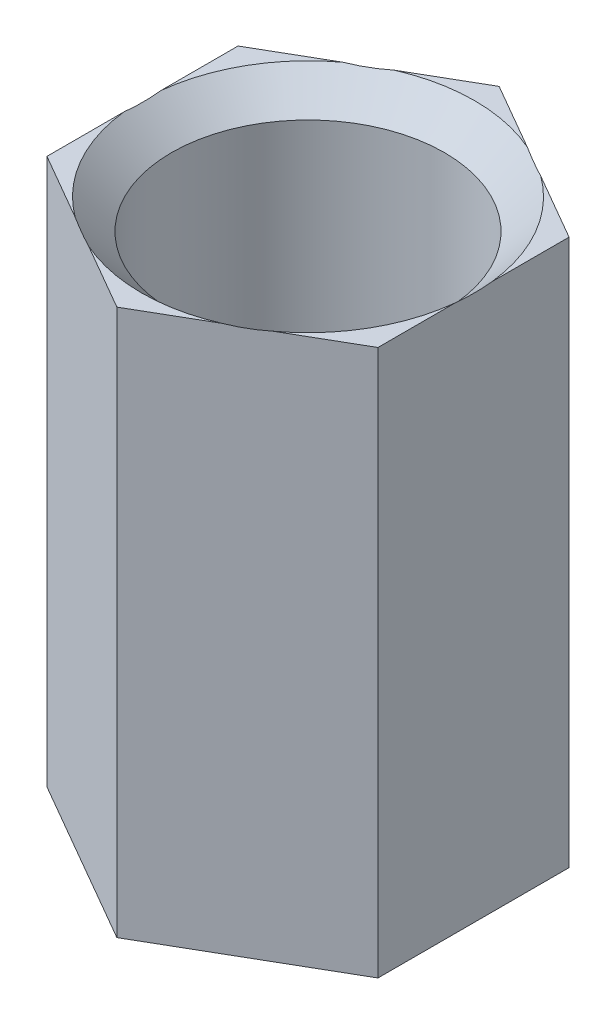
ISO-10303-21;
HEADER;
FILE_DESCRIPTION(('STEP AP214'),'2;1');
FILE_NAME('part.step','',(''),(''),'','','');
FILE_SCHEMA(('AUTOMOTIVE_DESIGN { 1 0 10303 214 1 1 1 1 }'));
ENDSEC;
DATA;
#1=APPLICATION_CONTEXT('core data for automotive mechanical design processes');
#2=APPLICATION_PROTOCOL_DEFINITION('international standard','automotive_design',2000,#1);
#3=PRODUCT_CONTEXT('',#1,'mechanical');
#4=PRODUCT('Part','Part','',(#3));
#5=PRODUCT_RELATED_PRODUCT_CATEGORY('part','',(#4));
#6=PRODUCT_DEFINITION_FORMATION('','',#4);
#7=PRODUCT_DEFINITION_CONTEXT('part definition',#1,'design');
#8=PRODUCT_DEFINITION('design','',#6,#7);
#9=PRODUCT_DEFINITION_SHAPE('','',#8);
#10=(LENGTH_UNIT() NAMED_UNIT(*) SI_UNIT(.MILLI.,.METRE.));
#11=(NAMED_UNIT(*) PLANE_ANGLE_UNIT() SI_UNIT($,.RADIAN.));
#12=(NAMED_UNIT(*) SI_UNIT($,.STERADIAN.) SOLID_ANGLE_UNIT());
#13=UNCERTAINTY_MEASURE_WITH_UNIT(LENGTH_MEASURE(1.E-05),#10,'distance_accuracy_value','');
#14=(GEOMETRIC_REPRESENTATION_CONTEXT(3) GLOBAL_UNCERTAINTY_ASSIGNED_CONTEXT((#13)) GLOBAL_UNIT_ASSIGNED_CONTEXT((#10,
#11,#12)) REPRESENTATION_CONTEXT('',''));
#15=CARTESIAN_POINT('',(0.,0.,0.));
#16=DIRECTION('',(0.,0.,1.));
#17=DIRECTION('',(1.,0.,0.));
#18=AXIS2_PLACEMENT_3D('',#15,#16,#17);
#19=CARTESIAN_POINT('',(0.,5.,0.));
#20=DIRECTION('',(0.,1.,0.));
#21=DIRECTION('',(0.,0.,1.));
#22=AXIS2_PLACEMENT_3D('',#19,#20,#21);
#23=PLANE('',#22);
#24=CARTESIAN_POINT('',(0.,5.,0.));
#25=DIRECTION('',(0.,1.,0.));
#26=DIRECTION('',(0.,0.,1.));
#27=AXIS2_PLACEMENT_3D('',#24,#25,#26);
#28=CIRCLE('',#27,1.525);
#29=CARTESIAN_POINT('',(0.904613979867253,5.,1.22772087521095));
#30=VERTEX_POINT('',#29);
#31=CARTESIAN_POINT('',(1.51554445662277,5.,0.169558249578151));
#32=VERTEX_POINT('',#31);
#33=EDGE_CURVE('E48',#30,#32,#28,.T.);
#34=ORIENTED_EDGE('',*,*,#33,.F.);
#35=DIRECTION('',(0.86602540378444,0.,-0.499999999999998));
#36=VECTOR('',#35,1.);
#37=CARTESIAN_POINT('',(0.757772228311382,5.,1.3125));
#38=LINE('',#37,#36);
#39=CARTESIAN_POINT('',(1.51554445662276,5.,0.875000000000007));
#40=VERTEX_POINT('',#39);
#41=EDGE_CURVE('E64',#30,#40,#38,.T.);
#42=ORIENTED_EDGE('',*,*,#41,.T.);
#43=DIRECTION('',(0.,0.,-1.));
#44=VECTOR('',#43,1.);
#45=CARTESIAN_POINT('',(1.51554445662277,5.,0.));
#46=LINE('',#45,#44);
#47=EDGE_CURVE('E211',#40,#32,#46,.T.);
#48=ORIENTED_EDGE('',*,*,#47,.T.);
#49=EDGE_LOOP('',(#34,#42,#48));
#50=FACE_BOUND('',#49,.T.);
#51=ADVANCED_FACE('F35',(#50),#23,.T.);
#52=CARTESIAN_POINT('',(1.51554445662277,5.,-0.16955824957814));
#53=VERTEX_POINT('',#52);
#54=CARTESIAN_POINT('',(0.904613979867278,5.,-1.22772087521093));
#55=VERTEX_POINT('',#54);
#56=EDGE_CURVE('E175',#53,#55,#28,.T.);
#57=ORIENTED_EDGE('',*,*,#56,.F.);
#58=CARTESIAN_POINT('',(1.51554445662277,5.,-0.874999999999996));
#59=VERTEX_POINT('',#58);
#60=EDGE_CURVE('E159',#53,#59,#46,.T.);
#61=ORIENTED_EDGE('',*,*,#60,.T.);
#62=DIRECTION('',(0.866025403784438,0.,0.500000000000001));
#63=VECTOR('',#62,1.);
#64=CARTESIAN_POINT('',(0.757772228311385,5.,-1.3125));
#65=LINE('',#64,#63);
#66=EDGE_CURVE('E100',#55,#59,#65,.T.);
#67=ORIENTED_EDGE('',*,*,#66,.F.);
#68=EDGE_LOOP('',(#57,#61,#67));
#69=FACE_BOUND('',#68,.T.);
#70=ADVANCED_FACE('F267',(#69),#23,.T.);
#71=CARTESIAN_POINT('',(0.610930476755493,5.,-1.39727912478907));
#72=VERTEX_POINT('',#71);
#73=CARTESIAN_POINT('',(-0.610930476755528,5.,-1.39727912478905));
#74=VERTEX_POINT('',#73);
#75=EDGE_CURVE('E180',#72,#74,#28,.T.);
#76=ORIENTED_EDGE('',*,*,#75,.F.);
#77=CARTESIAN_POINT('',(0.,5.,-1.75));
#78=VERTEX_POINT('',#77);
#79=EDGE_CURVE('E207',#78,#72,#65,.T.);
#80=ORIENTED_EDGE('',*,*,#79,.F.);
#81=DIRECTION('',(0.866025403784441,0.,-0.499999999999995));
#82=VECTOR('',#81,1.);
#83=CARTESIAN_POINT('',(-0.757772228311379,5.,-1.31250000000001));
#84=LINE('',#83,#82);
#85=EDGE_CURVE('E206',#74,#78,#84,.T.);
#86=ORIENTED_EDGE('',*,*,#85,.F.);
#87=EDGE_LOOP('',(#76,#80,#86));
#88=FACE_BOUND('',#87,.T.);
#89=ADVANCED_FACE('F272',(#88),#23,.T.);
#90=CARTESIAN_POINT('',(-0.90461397986723,5.,-1.22772087521096));
#91=VERTEX_POINT('',#90);
#92=CARTESIAN_POINT('',(-1.51554445662277,5.,-0.169558249578154));
#93=VERTEX_POINT('',#92);
#94=EDGE_CURVE('E172',#91,#93,#28,.T.);
#95=ORIENTED_EDGE('',*,*,#94,.F.);
#96=CARTESIAN_POINT('',(-1.51554445662276,5.,-0.875000000000016));
#97=VERTEX_POINT('',#96);
#98=EDGE_CURVE('E124',#97,#91,#84,.T.);
#99=ORIENTED_EDGE('',*,*,#98,.F.);
#100=DIRECTION('',(0.,0.,1.));
#101=VECTOR('',#100,1.);
#102=CARTESIAN_POINT('',(-1.51554445662277,5.,0.));
#103=LINE('',#102,#101);
#104=EDGE_CURVE('E123',#97,#93,#103,.T.);
#105=ORIENTED_EDGE('',*,*,#104,.T.);
#106=EDGE_LOOP('',(#95,#99,#105));
#107=FACE_BOUND('',#106,.T.);
#108=ADVANCED_FACE('F204',(#107),#23,.T.);
#109=CARTESIAN_POINT('',(-1.51554445662277,5.,0.169558249578124));
#110=VERTEX_POINT('',#109);
#111=CARTESIAN_POINT('',(-0.904613979867304,5.,1.22772087521091));
#112=VERTEX_POINT('',#111);
#113=EDGE_CURVE('E120',#110,#112,#28,.T.);
#114=ORIENTED_EDGE('',*,*,#113,.F.);
#115=CARTESIAN_POINT('',(-1.51554445662278,5.,0.874999999999986));
#116=VERTEX_POINT('',#115);
#117=EDGE_CURVE('E114',#110,#116,#103,.T.);
#118=ORIENTED_EDGE('',*,*,#117,.T.);
#119=DIRECTION('',(0.866025403784436,0.,0.500000000000004));
#120=VECTOR('',#119,1.);
#121=CARTESIAN_POINT('',(-0.757772228311388,5.,1.31249999999999));
#122=LINE('',#121,#120);
#123=EDGE_CURVE('E118',#116,#112,#122,.T.);
#124=ORIENTED_EDGE('',*,*,#123,.T.);
#125=EDGE_LOOP('',(#114,#118,#124));
#126=FACE_BOUND('',#125,.T.);
#127=ADVANCED_FACE('F116',(#126),#23,.T.);
#128=CARTESIAN_POINT('',(1.51554445662277,5.,0.));
#129=DIRECTION('',(-1.,0.,0.));
#130=DIRECTION('',(0.,0.,1.));
#131=AXIS2_PLACEMENT_3D('',#128,#129,#130);
#132=PLANE('',#131);
#133=ORIENTED_EDGE('',*,*,#60,.F.);
#134=CARTESIAN_POINT('',(1.51554445662278,6.69505341016123,-2.84110347651944));
#135=CARTESIAN_POINT('',(1.51554445662278,6.64536074219866,-2.78477887010775));
#136=CARTESIAN_POINT('',(1.51554445662278,6.59584781769118,-2.72829510933204));
#137=CARTESIAN_POINT('',(1.51554445662278,6.49725564688589,-2.6149454970231));
#138=CARTESIAN_POINT('',(1.51554445662278,6.44817642267612,-2.55807962628597));
#139=CARTESIAN_POINT('',(1.51554445662278,6.30154498406784,-2.38663098863078));
#140=CARTESIAN_POINT('',(1.51554445662277,6.20476557714023,-2.27138500649873));
#141=CARTESIAN_POINT('',(1.51554445662277,6.01073519795948,-2.03419364323101));
#142=CARTESIAN_POINT('',(1.51554445662277,5.91359459645915,-1.9121569230607));
#143=CARTESIAN_POINT('',(1.51554445662277,5.7717551866164,-1.72620719621323));
#144=CARTESIAN_POINT('',(1.51554445662277,5.72513528470081,-1.66376246222309));
#145=CARTESIAN_POINT('',(1.51554445662277,5.63356453007001,-1.53766441590645));
#146=CARTESIAN_POINT('',(1.51554445662277,5.58861351908624,-1.47401121905374));
#147=CARTESIAN_POINT('',(1.51554445662277,5.49929719751163,-1.34286793428589));
#148=CARTESIAN_POINT('',(1.51554445662277,5.45501262665856,-1.27532249302574));
#149=CARTESIAN_POINT('',(1.51554445662277,5.36959657164407,-1.13820116405942));
#150=CARTESIAN_POINT('',(1.51554445662277,5.32846661290652,-1.06862431623176));
#151=CARTESIAN_POINT('',(1.51554445662277,5.25094247168095,-0.927649847059573));
#152=CARTESIAN_POINT('',(1.51554445662277,5.21450968362879,-0.856273724566307));
#153=CARTESIAN_POINT('',(1.51554445662277,5.14769576099776,-0.710776375614171));
#154=CARTESIAN_POINT('',(1.51554445662277,5.11730736907987,-0.63665856944968));
#155=CARTESIAN_POINT('',(1.51554445662277,5.07065843486609,-0.502277484843412));
#156=CARTESIAN_POINT('',(1.51554445662277,5.05275916452401,-0.4425915313544));
#157=CARTESIAN_POINT('',(1.51554445662277,5.0231887850271,-0.321640495215606));
#158=CARTESIAN_POINT('',(1.51554445662277,5.01152002438015,-0.260374826221821));
#159=CARTESIAN_POINT('',(1.51554445662277,4.99375442151035,-0.123507659604688));
#160=CARTESIAN_POINT('',(1.51554445662277,4.98940338648948,-0.0476655843192664));
#161=CARTESIAN_POINT('',(1.51554445662277,4.99220383861624,0.103722393349564));
#162=CARTESIAN_POINT('',(1.51554445662277,4.99934387879313,0.179268515418656));
#163=CARTESIAN_POINT('',(1.51554445662277,5.02099046102885,0.310383091815035));
#164=CARTESIAN_POINT('',(1.51554445662277,5.03328189800846,0.366339887656791));
#165=CARTESIAN_POINT('',(1.51554445662276,5.06291631648253,0.476905749188153));
#166=CARTESIAN_POINT('',(1.51554445662276,5.08026129884691,0.531514271742963));
#167=CARTESIAN_POINT('',(1.51554445662276,5.11931819349103,0.639923921804889));
#168=CARTESIAN_POINT('',(1.51554445662276,5.14108390273353,0.693705348116334));
#169=CARTESIAN_POINT('',(1.51554445662276,5.18795661951914,0.799752006078874));
#170=CARTESIAN_POINT('',(1.51554445662276,5.21306255584965,0.85201771730273));
#171=CARTESIAN_POINT('',(1.51554445662276,5.28658998241615,0.995619642428295));
#172=CARTESIAN_POINT('',(1.51554445662276,5.33786842958129,1.0854859533046));
#173=CARTESIAN_POINT('',(1.51554445662276,5.44588971672179,1.26189588552919));
#174=CARTESIAN_POINT('',(1.51554445662276,5.50263738928843,1.34843647208388));
#175=CARTESIAN_POINT('',(1.51554445662276,5.62006202720288,1.51930138746298));
#176=CARTESIAN_POINT('',(1.51554445662276,5.68075381809912,1.60361545292867));
#177=CARTESIAN_POINT('',(1.51554445662276,5.80475214692481,1.77030131573583));
#178=CARTESIAN_POINT('',(1.51554445662276,5.86805905219851,1.85267283763849));
#179=CARTESIAN_POINT('',(1.51554445662276,5.99107181738946,2.00894410593667));
#180=CARTESIAN_POINT('',(1.51554445662276,6.05062296601051,2.08296617927262));
#181=CARTESIAN_POINT('',(1.51554445662276,6.17094202248322,2.23002552353116));
#182=CARTESIAN_POINT('',(1.51554445662276,6.23171005960111,2.3030626884362));
#183=CARTESIAN_POINT('',(1.51554445662276,6.3536115976352,2.44765833495206));
#184=CARTESIAN_POINT('',(1.51554445662276,6.41473628812124,2.51922426301348));
#185=CARTESIAN_POINT('',(1.51554445662276,6.53771860053789,2.66169888874581));
#186=CARTESIAN_POINT('',(1.51554445662276,6.59957607206431,2.73260771613923));
#187=CARTESIAN_POINT('',(1.51554445662276,6.66171693233548,2.80326413433226));
#188=B_SPLINE_CURVE_WITH_KNOTS('',3,(#134,#135,#136,#137,#138,#139,#140,#141,#142,#143,#144,
#145,#146,#147,#148,#149,#150,#151,#152,#153,#154,#155,#156,#157,#158,#159,#160,#161,#162,#163,
#164,#165,#166,#167,#168,#169,#170,#171,#172,#173,#174,#175,#176,#177,#178,#179,#180,#181,#182,
#183,#184,#185,#186,#187),.UNSPECIFIED.,.F.,.F.,(4,2,2,2,2,2,2,2,2,2,2,2,2,2,2,2,2,2,2,2,2,2,2,
2,2,2,4),(0.,0.225336276008993,0.450683962850738,0.90213234254857,1.36996577171335,
1.60372923581388,1.8374704741339,2.07971152653392,2.32206898646828,2.56228670098192,
2.80221422819994,2.98887522345913,3.17560652852004,3.40263404828583,3.62943555184721,
3.80105245710387,3.97273740386474,4.14665242135235,4.32051179804259,4.63057851625184,
4.94092176511299,5.25250784624041,5.56413784559485,5.8491316185301,6.13415582775585,
6.41649974979589,6.69878669132298),.UNSPECIFIED.);
#189=EDGE_CURVE('E202',#53,#32,#188,.T.);
#190=ORIENTED_EDGE('',*,*,#189,.T.);
#191=ORIENTED_EDGE('',*,*,#47,.F.);
#192=DIRECTION('',(0.,-1.,0.));
#193=VECTOR('',#192,1.);
#194=CARTESIAN_POINT('',(1.51554445662276,5.,0.875000000000007));
#195=LINE('',#194,#193);
#196=CARTESIAN_POINT('',(1.51554445662276,0.,0.875000000000007));
#197=VERTEX_POINT('',#196);
#198=EDGE_CURVE('E145',#40,#197,#195,.T.);
#199=ORIENTED_EDGE('',*,*,#198,.T.);
#200=DIRECTION('',(0.,0.,-1.));
#201=VECTOR('',#200,1.);
#202=CARTESIAN_POINT('',(1.51554445662277,0.,0.));
#203=LINE('',#202,#201);
#204=CARTESIAN_POINT('',(1.51554445662277,0.,-0.874999999999996));
#205=VERTEX_POINT('',#204);
#206=EDGE_CURVE('E146',#197,#205,#203,.T.);
#207=ORIENTED_EDGE('',*,*,#206,.T.);
#208=DIRECTION('',(0.,-1.,0.));
#209=VECTOR('',#208,1.);
#210=CARTESIAN_POINT('',(1.51554445662277,5.,-0.874999999999996));
#211=LINE('',#210,#209);
#212=EDGE_CURVE('E164',#59,#205,#211,.T.);
#213=ORIENTED_EDGE('',*,*,#212,.F.);
#214=EDGE_LOOP('',(#133,#190,#191,#199,#207,#213));
#215=FACE_BOUND('',#214,.T.);
#216=ADVANCED_FACE('F37',(#215),#132,.F.);
#217=CARTESIAN_POINT('',(0.757772228311385,5.,-1.3125));
#218=DIRECTION('',(0.500000000000001,0.,-0.866025403784438));
#219=DIRECTION('',(-0.866025403784438,0.,-0.500000000000001));
#220=AXIS2_PLACEMENT_3D('',#217,#218,#219);
#221=PLANE('',#220);
#222=CARTESIAN_POINT('',(0.906163703807823,5.0002,-1.22682614167668));
#223=CARTESIAN_POINT('',(0.85669987864235,4.99376297108185,-1.25538409445112));
#224=CARTESIAN_POINT('',(0.807236053476877,4.99054445662277,-1.28394204722555));
#225=CARTESIAN_POINT('',(0.708308403145932,4.99054445662277,-1.34105795277442));
#226=CARTESIAN_POINT('',(0.658844577980459,4.99376297108184,-1.36961590554886));
#227=CARTESIAN_POINT('',(0.609380752814986,5.0002,-1.39817385832329));
#228=B_SPLINE_CURVE_WITH_KNOTS('',3,(#222,#223,#224,#225,#226,#227),.UNSPECIFIED.,.F.,.F.,(4,2,
4),(0.,0.171619548763872,0.343239097527744),.UNSPECIFIED.);
#229=EDGE_CURVE('E11',#55,#72,#228,.T.);
#230=ORIENTED_EDGE('',*,*,#229,.F.);
#231=ORIENTED_EDGE('',*,*,#66,.T.);
#232=ORIENTED_EDGE('',*,*,#212,.T.);
#233=DIRECTION('',(0.866025403784438,0.,0.500000000000001));
#234=VECTOR('',#233,1.);
#235=CARTESIAN_POINT('',(0.757772228311385,0.,-1.3125));
#236=LINE('',#235,#234);
#237=CARTESIAN_POINT('',(0.,0.,-1.75));
#238=VERTEX_POINT('',#237);
#239=EDGE_CURVE('E149',#238,#205,#236,.T.);
#240=ORIENTED_EDGE('',*,*,#239,.F.);
#241=DIRECTION('',(0.,-1.,0.));
#242=VECTOR('',#241,1.);
#243=CARTESIAN_POINT('',(0.,5.,-1.75));
#244=LINE('',#243,#242);
#245=EDGE_CURVE('E163',#78,#238,#244,.T.);
#246=ORIENTED_EDGE('',*,*,#245,.F.);
#247=ORIENTED_EDGE('',*,*,#79,.T.);
#248=EDGE_LOOP('',(#230,#231,#232,#240,#246,#247));
#249=FACE_BOUND('',#248,.T.);
#250=ADVANCED_FACE('F287',(#249),#221,.T.);
#251=CARTESIAN_POINT('',(-0.757772228311379,5.,-1.31250000000001));
#252=DIRECTION('',(-0.499999999999995,0.,-0.866025403784441));
#253=DIRECTION('',(-0.866025403784441,0.,0.499999999999995));
#254=AXIS2_PLACEMENT_3D('',#251,#252,#253);
#255=PLANE('',#254);
#256=CARTESIAN_POINT('',(-0.60938075281502,5.0002,-1.39817385832328));
#257=CARTESIAN_POINT('',(-0.658844577980473,4.99376297108185,-1.36961590554885));
#258=CARTESIAN_POINT('',(-0.708308403145926,4.99054445662277,-1.34105795277443));
#259=CARTESIAN_POINT('',(-0.807236053476831,4.99054445662277,-1.28394204722559));
#260=CARTESIAN_POINT('',(-0.856699878642284,4.99376297108185,-1.25538409445116));
#261=CARTESIAN_POINT('',(-0.906163703807737,5.0002,-1.22682614167674));
#262=B_SPLINE_CURVE_WITH_KNOTS('',3,(#256,#257,#258,#259,#260,#261),.UNSPECIFIED.,.F.,.F.,(4,2,
4),(0.,0.171619548763802,0.343239097527604),.UNSPECIFIED.);
#263=EDGE_CURVE('E195',#74,#91,#262,.T.);
#264=ORIENTED_EDGE('',*,*,#263,.F.);
#265=ORIENTED_EDGE('',*,*,#85,.T.);
#266=ORIENTED_EDGE('',*,*,#245,.T.);
#267=DIRECTION('',(0.866025403784441,0.,-0.499999999999995));
#268=VECTOR('',#267,1.);
#269=CARTESIAN_POINT('',(-0.757772228311379,0.,-1.31250000000001));
#270=LINE('',#269,#268);
#271=CARTESIAN_POINT('',(-1.51554445662276,0.,-0.875000000000016));
#272=VERTEX_POINT('',#271);
#273=EDGE_CURVE('E152',#272,#238,#270,.T.);
#274=ORIENTED_EDGE('',*,*,#273,.F.);
#275=DIRECTION('',(0.,-1.,0.));
#276=VECTOR('',#275,1.);
#277=CARTESIAN_POINT('',(-1.51554445662276,5.,-0.875000000000016));
#278=LINE('',#277,#276);
#279=EDGE_CURVE('E133',#97,#272,#278,.T.);
#280=ORIENTED_EDGE('',*,*,#279,.F.);
#281=ORIENTED_EDGE('',*,*,#98,.T.);
#282=EDGE_LOOP('',(#264,#265,#266,#274,#280,#281));
#283=FACE_BOUND('',#282,.T.);
#284=ADVANCED_FACE('F300',(#283),#255,.T.);
#285=CARTESIAN_POINT('',(-1.51554445662277,5.,0.));
#286=DIRECTION('',(1.,0.,0.));
#287=DIRECTION('',(0.,0.,-1.));
#288=AXIS2_PLACEMENT_3D('',#285,#286,#287);
#289=PLANE('',#288);
#290=ORIENTED_EDGE('',*,*,#117,.F.);
#291=CARTESIAN_POINT('',(-1.51554445662274,6.69505341016122,-2.84110347651945));
#292=CARTESIAN_POINT('',(-1.51554445662274,6.64536074219866,-2.78477887010776));
#293=CARTESIAN_POINT('',(-1.51554445662274,6.59584781769118,-2.72829510933205));
#294=CARTESIAN_POINT('',(-1.51554445662274,6.49725564688588,-2.61494549702311));
#295=CARTESIAN_POINT('',(-1.51554445662274,6.44817642267612,-2.55807962628598));
#296=CARTESIAN_POINT('',(-1.51554445662274,6.30154498406783,-2.3866309886308));
#297=CARTESIAN_POINT('',(-1.51554445662274,6.20476557714022,-2.27138500649874));
#298=CARTESIAN_POINT('',(-1.51554445662275,6.01073519795947,-2.03419364323102));
#299=CARTESIAN_POINT('',(-1.51554445662275,5.91359459645915,-1.91215692306071));
#300=CARTESIAN_POINT('',(-1.51554445662275,5.77175518661639,-1.72620719621324));
#301=CARTESIAN_POINT('',(-1.51554445662275,5.72513528470081,-1.6637624622231));
#302=CARTESIAN_POINT('',(-1.51554445662275,5.63356453007001,-1.53766441590646));
#303=CARTESIAN_POINT('',(-1.51554445662275,5.58861351908624,-1.47401121905376));
#304=CARTESIAN_POINT('',(-1.51554445662275,5.49929719751163,-1.34286793428591));
#305=CARTESIAN_POINT('',(-1.51554445662275,5.45501262665855,-1.27532249302575));
#306=CARTESIAN_POINT('',(-1.51554445662276,5.36959657164407,-1.13820116405943));
#307=CARTESIAN_POINT('',(-1.51554445662276,5.32846661290651,-1.06862431623177));
#308=CARTESIAN_POINT('',(-1.51554445662276,5.25094247168095,-0.927649847059589));
#309=CARTESIAN_POINT('',(-1.51554445662276,5.21450968362879,-0.856273724566323));
#310=CARTESIAN_POINT('',(-1.51554445662276,5.14769576099776,-0.710776375614187));
#311=CARTESIAN_POINT('',(-1.51554445662276,5.11730736907987,-0.636658569449696));
#312=CARTESIAN_POINT('',(-1.51554445662276,5.07065843486609,-0.502277484843429));
#313=CARTESIAN_POINT('',(-1.51554445662276,5.05275916452401,-0.442591531354418));
#314=CARTESIAN_POINT('',(-1.51554445662276,5.0231887850271,-0.321640495215625));
#315=CARTESIAN_POINT('',(-1.51554445662276,5.01152002438015,-0.26037482622184));
#316=CARTESIAN_POINT('',(-1.51554445662277,4.99375442151035,-0.123507659604708));
#317=CARTESIAN_POINT('',(-1.51554445662277,4.98940338648948,-0.0476655843192865));
#318=CARTESIAN_POINT('',(-1.51554445662277,4.99220383861624,0.103722393349544));
#319=CARTESIAN_POINT('',(-1.51554445662277,4.99934387879313,0.179268515418636));
#320=CARTESIAN_POINT('',(-1.51554445662277,5.02099046102885,0.310383091815015));
#321=CARTESIAN_POINT('',(-1.51554445662277,5.03328189800846,0.366339887656771));
#322=CARTESIAN_POINT('',(-1.51554445662277,5.06291631648253,0.476905749188133));
#323=CARTESIAN_POINT('',(-1.51554445662277,5.08026129884691,0.531514271742944));
#324=CARTESIAN_POINT('',(-1.51554445662277,5.11931819349103,0.63992392180487));
#325=CARTESIAN_POINT('',(-1.51554445662277,5.14108390273353,0.693705348116316));
#326=CARTESIAN_POINT('',(-1.51554445662278,5.18795661951914,0.799752006078855));
#327=CARTESIAN_POINT('',(-1.51554445662278,5.21306255584965,0.852017717302711));
#328=CARTESIAN_POINT('',(-1.51554445662278,5.28658998241615,0.995619642428276));
#329=CARTESIAN_POINT('',(-1.51554445662278,5.3378684295813,1.08548595330459));
#330=CARTESIAN_POINT('',(-1.51554445662278,5.44588971672179,1.26189588552918));
#331=CARTESIAN_POINT('',(-1.51554445662278,5.50263738928844,1.34843647208387));
#332=CARTESIAN_POINT('',(-1.51554445662278,5.62006202720289,1.51930138746296));
#333=CARTESIAN_POINT('',(-1.51554445662278,5.68075381809913,1.60361545292865));
#334=CARTESIAN_POINT('',(-1.51554445662278,5.80475214692482,1.77030131573582));
#335=CARTESIAN_POINT('',(-1.51554445662279,5.86805905219852,1.85267283763848));
#336=CARTESIAN_POINT('',(-1.51554445662279,5.99107181738947,2.00894410593665));
#337=CARTESIAN_POINT('',(-1.51554445662279,6.05062296601051,2.08296617927261));
#338=CARTESIAN_POINT('',(-1.51554445662279,6.17094202248323,2.23002552353115));
#339=CARTESIAN_POINT('',(-1.51554445662279,6.23171005960112,2.30306268843618));
#340=CARTESIAN_POINT('',(-1.51554445662279,6.3536115976352,2.44765833495205));
#341=CARTESIAN_POINT('',(-1.51554445662279,6.41473628812124,2.51922426301347));
#342=CARTESIAN_POINT('',(-1.51554445662279,6.53771860053789,2.6616988887458));
#343=CARTESIAN_POINT('',(-1.51554445662279,6.59957607206432,2.73260771613922));
#344=CARTESIAN_POINT('',(-1.5155444566228,6.66171693233549,2.80326413433225));
#345=B_SPLINE_CURVE_WITH_KNOTS('',3,(#291,#292,#293,#294,#295,#296,#297,#298,#299,#300,#301,
#302,#303,#304,#305,#306,#307,#308,#309,#310,#311,#312,#313,#314,#315,#316,#317,#318,#319,#320,
#321,#322,#323,#324,#325,#326,#327,#328,#329,#330,#331,#332,#333,#334,#335,#336,#337,#338,#339,
#340,#341,#342,#343,#344),.UNSPECIFIED.,.F.,.F.,(4,2,2,2,2,2,2,2,2,2,2,2,2,2,2,2,2,2,2,2,2,2,2,
2,2,2,4),(0.,0.225336276008991,0.450683962850737,0.902132342548569,1.36996577171335,
1.60372923581388,1.83747047413389,2.07971152653391,2.32206898646828,2.56228670098191,
2.80221422819993,2.98887522345912,3.17560652852003,3.40263404828582,3.6294355518472,
3.80105245710386,3.97273740386473,4.14665242135234,4.32051179804258,4.63057851625183,
4.94092176511298,5.2525078462404,5.56413784559485,5.8491316185301,6.13415582775585,
6.41649974979588,6.69878669132298),.UNSPECIFIED.);
#346=EDGE_CURVE('E193',#110,#93,#345,.F.);
#347=ORIENTED_EDGE('',*,*,#346,.T.);
#348=ORIENTED_EDGE('',*,*,#104,.F.);
#349=ORIENTED_EDGE('',*,*,#279,.T.);
#350=DIRECTION('',(0.,0.,1.));
#351=VECTOR('',#350,1.);
#352=CARTESIAN_POINT('',(-1.51554445662277,0.,0.));
#353=LINE('',#352,#351);
#354=CARTESIAN_POINT('',(-1.51554445662278,0.,0.874999999999986));
#355=VERTEX_POINT('',#354);
#356=EDGE_CURVE('E130',#272,#355,#353,.T.);
#357=ORIENTED_EDGE('',*,*,#356,.T.);
#358=DIRECTION('',(0.,-1.,0.));
#359=VECTOR('',#358,1.);
#360=CARTESIAN_POINT('',(-1.51554445662278,5.,0.874999999999986));
#361=LINE('',#360,#359);
#362=EDGE_CURVE('E127',#116,#355,#361,.T.);
#363=ORIENTED_EDGE('',*,*,#362,.F.);
#364=EDGE_LOOP('',(#290,#347,#348,#349,#357,#363));
#365=FACE_BOUND('',#364,.T.);
#366=ADVANCED_FACE('F128',(#365),#289,.F.);
#367=CARTESIAN_POINT('',(-0.757772228311388,5.,1.31249999999999));
#368=DIRECTION('',(0.500000000000004,0.,-0.866025403784436));
#369=DIRECTION('',(-0.866025403784436,0.,-0.500000000000004));
#370=AXIS2_PLACEMENT_3D('',#367,#368,#369);
#371=PLANE('',#370);
#372=CARTESIAN_POINT('',(-0.610930476755472,5.,1.39727912478908));
#373=VERTEX_POINT('',#372);
#374=CARTESIAN_POINT('',(0.,5.,1.75));
#375=VERTEX_POINT('',#374);
#376=EDGE_CURVE('E138',#373,#375,#122,.T.);
#377=ORIENTED_EDGE('',*,*,#376,.F.);
#378=CARTESIAN_POINT('',(-0.609380752814967,5.0002,1.3981738583233));
#379=CARTESIAN_POINT('',(-0.65884457798044,4.99376297108184,1.36961590554886));
#380=CARTESIAN_POINT('',(-0.708308403145914,4.99054445662277,1.34105795277443));
#381=CARTESIAN_POINT('',(-0.807236053476861,4.99054445662277,1.28394204722556));
#382=CARTESIAN_POINT('',(-0.856699878642335,4.99376297108184,1.25538409445112));
#383=CARTESIAN_POINT('',(-0.906163703807808,5.0002,1.22682614167669));
#384=B_SPLINE_CURVE_WITH_KNOTS('',3,(#378,#379,#380,#381,#382,#383),.UNSPECIFIED.,.F.,.F.,(4,2,
4),(0.,0.171619548763876,0.343239097527751),.UNSPECIFIED.);
#385=EDGE_CURVE('E55',#373,#112,#384,.T.);
#386=ORIENTED_EDGE('',*,*,#385,.T.);
#387=ORIENTED_EDGE('',*,*,#123,.F.);
#388=ORIENTED_EDGE('',*,*,#362,.T.);
#389=DIRECTION('',(0.866025403784436,0.,0.500000000000004));
#390=VECTOR('',#389,1.);
#391=CARTESIAN_POINT('',(-0.757772228311388,0.,1.31249999999999));
#392=LINE('',#391,#390);
#393=CARTESIAN_POINT('',(0.,0.,1.75));
#394=VERTEX_POINT('',#393);
#395=EDGE_CURVE('E156',#355,#394,#392,.T.);
#396=ORIENTED_EDGE('',*,*,#395,.T.);
#397=DIRECTION('',(0.,-1.,0.));
#398=VECTOR('',#397,1.);
#399=CARTESIAN_POINT('',(0.,5.,1.75));
#400=LINE('',#399,#398);
#401=EDGE_CURVE('E134',#375,#394,#400,.T.);
#402=ORIENTED_EDGE('',*,*,#401,.F.);
#403=EDGE_LOOP('',(#377,#386,#387,#388,#396,#402));
#404=FACE_BOUND('',#403,.T.);
#405=ADVANCED_FACE('F137',(#404),#371,.F.);
#406=CARTESIAN_POINT('',(0.757772228311382,5.,1.3125));
#407=DIRECTION('',(-0.499999999999998,0.,-0.86602540378444));
#408=DIRECTION('',(-0.86602540378444,0.,0.499999999999998));
#409=AXIS2_PLACEMENT_3D('',#406,#407,#408);
#410=PLANE('',#409);
#411=ORIENTED_EDGE('',*,*,#41,.F.);
#412=CARTESIAN_POINT('',(0.906163703807796,5.0002,1.2268261416767));
#413=CARTESIAN_POINT('',(0.856699878642331,4.99376297108185,1.25538409445113));
#414=CARTESIAN_POINT('',(0.807236053476867,4.99054445662277,1.28394204722556));
#415=CARTESIAN_POINT('',(0.708308403145937,4.99054445662277,1.34105795277442));
#416=CARTESIAN_POINT('',(0.658844577980472,4.99376297108185,1.36961590554885));
#417=CARTESIAN_POINT('',(0.609380752815007,5.0002,1.39817385832328));
#418=B_SPLINE_CURVE_WITH_KNOTS('',3,(#412,#413,#414,#415,#416,#417),.UNSPECIFIED.,.F.,.F.,(4,2,
4),(0.,0.171619548763844,0.343239097527689),.UNSPECIFIED.);
#419=CARTESIAN_POINT('',(0.610930476755511,5.,1.39727912478906));
#420=VERTEX_POINT('',#419);
#421=EDGE_CURVE('E243',#30,#420,#418,.T.);
#422=ORIENTED_EDGE('',*,*,#421,.T.);
#423=EDGE_CURVE('E140',#375,#420,#38,.T.);
#424=ORIENTED_EDGE('',*,*,#423,.F.);
#425=ORIENTED_EDGE('',*,*,#401,.T.);
#426=DIRECTION('',(0.86602540378444,0.,-0.499999999999998));
#427=VECTOR('',#426,1.);
#428=CARTESIAN_POINT('',(0.757772228311382,0.,1.3125));
#429=LINE('',#428,#427);
#430=EDGE_CURVE('E92',#394,#197,#429,.T.);
#431=ORIENTED_EDGE('',*,*,#430,.T.);
#432=ORIENTED_EDGE('',*,*,#198,.F.);
#433=EDGE_LOOP('',(#411,#422,#424,#425,#431,#432));
#434=FACE_BOUND('',#433,.T.);
#435=ADVANCED_FACE('F276',(#434),#410,.F.);
#436=EDGE_CURVE('E165',#373,#420,#28,.T.);
#437=ORIENTED_EDGE('',*,*,#436,.F.);
#438=ORIENTED_EDGE('',*,*,#376,.T.);
#439=ORIENTED_EDGE('',*,*,#423,.T.);
#440=EDGE_LOOP('',(#437,#438,#439));
#441=FACE_BOUND('',#440,.T.);
#442=ADVANCED_FACE('F268',(#441),#23,.T.);
#443=CARTESIAN_POINT('',(0.,0.,0.));
#444=DIRECTION('',(0.,1.,0.));
#445=DIRECTION('',(0.,0.,1.));
#446=AXIS2_PLACEMENT_3D('',#443,#444,#445);
#447=PLANE('',#446);
#448=CARTESIAN_POINT('',(0.,0.,0.));
#449=DIRECTION('',(0.,1.,0.));
#450=DIRECTION('',(0.,0.,1.));
#451=AXIS2_PLACEMENT_3D('',#448,#449,#450);
#452=CIRCLE('',#451,1.25);
#453=CARTESIAN_POINT('',(0.,0.,1.25));
#454=VERTEX_POINT('',#453);
#455=EDGE_CURVE('E254',#454,#454,#452,.T.);
#456=ORIENTED_EDGE('',*,*,#455,.T.);
#457=EDGE_LOOP('',(#456));
#458=FACE_BOUND('',#457,.T.);
#459=ORIENTED_EDGE('',*,*,#206,.F.);
#460=ORIENTED_EDGE('',*,*,#430,.F.);
#461=ORIENTED_EDGE('',*,*,#395,.F.);
#462=ORIENTED_EDGE('',*,*,#356,.F.);
#463=ORIENTED_EDGE('',*,*,#273,.T.);
#464=ORIENTED_EDGE('',*,*,#239,.T.);
#465=EDGE_LOOP('',(#459,#460,#461,#462,#463,#464));
#466=FACE_BOUND('',#465,.T.);
#467=ADVANCED_FACE('F228',(#458,#466),#447,.F.);
#468=CARTESIAN_POINT('',(0.,5.,0.));
#469=DIRECTION('',(0.,1.,0.));
#470=DIRECTION('',(0.,0.,1.));
#471=AXIS2_PLACEMENT_3D('',#468,#469,#470);
#472=CONICAL_SURFACE('',#471,1.525,0.785398163397445);
#473=CARTESIAN_POINT('',(0.,4.725,0.));
#474=DIRECTION('',(0.,1.,0.));
#475=DIRECTION('',(0.,0.,1.));
#476=AXIS2_PLACEMENT_3D('',#473,#474,#475);
#477=CIRCLE('',#476,1.25);
#478=CARTESIAN_POINT('',(0.,4.725,1.25));
#479=VERTEX_POINT('',#478);
#480=EDGE_CURVE('E256',#479,#479,#477,.T.);
#481=ORIENTED_EDGE('',*,*,#480,.F.);
#482=EDGE_LOOP('',(#481));
#483=FACE_BOUND('',#482,.T.);
#484=ORIENTED_EDGE('',*,*,#436,.T.);
#485=ORIENTED_EDGE('',*,*,#421,.F.);
#486=ORIENTED_EDGE('',*,*,#33,.T.);
#487=ORIENTED_EDGE('',*,*,#189,.F.);
#488=ORIENTED_EDGE('',*,*,#56,.T.);
#489=ORIENTED_EDGE('',*,*,#229,.T.);
#490=ORIENTED_EDGE('',*,*,#75,.T.);
#491=ORIENTED_EDGE('',*,*,#263,.T.);
#492=ORIENTED_EDGE('',*,*,#94,.T.);
#493=ORIENTED_EDGE('',*,*,#346,.F.);
#494=ORIENTED_EDGE('',*,*,#113,.T.);
#495=ORIENTED_EDGE('',*,*,#385,.F.);
#496=EDGE_LOOP('',(#484,#485,#486,#487,#488,#489,#490,#491,#492,#493,#494,#495));
#497=FACE_BOUND('',#496,.T.);
#498=ADVANCED_FACE('F192',(#483,#497),#472,.F.);
#499=CARTESIAN_POINT('',(0.,5.,0.));
#500=DIRECTION('',(0.,1.,0.));
#501=DIRECTION('',(0.,0.,1.));
#502=AXIS2_PLACEMENT_3D('',#499,#500,#501);
#503=CYLINDRICAL_SURFACE('',#502,1.25);
#504=ORIENTED_EDGE('',*,*,#455,.F.);
#505=EDGE_LOOP('',(#504));
#506=FACE_BOUND('',#505,.T.);
#507=ORIENTED_EDGE('',*,*,#480,.T.);
#508=EDGE_LOOP('',(#507));
#509=FACE_BOUND('',#508,.T.);
#510=ADVANCED_FACE('F227',(#506,#509),#503,.F.);
#511=CLOSED_SHELL('',(#51,#70,#89,#108,#127,#216,#250,#284,#366,#405,#435,#442,#467,#498,#510));
#512=MANIFOLD_SOLID_BREP('B2',#511);
#513=ADVANCED_BREP_SHAPE_REPRESENTATION('',(#18,#512),#14);
#514=SHAPE_DEFINITION_REPRESENTATION(#9,#513);
ENDSEC;
END-ISO-10303-21;
